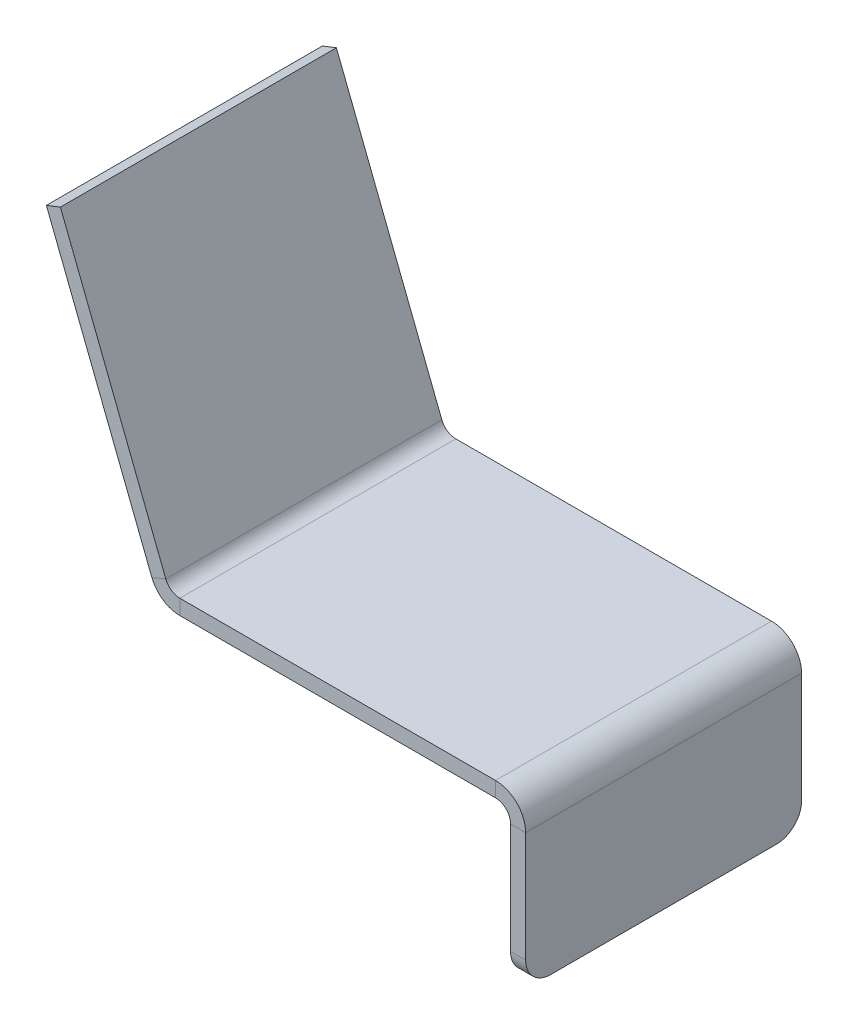
ISO-10303-21;
HEADER;
FILE_DESCRIPTION(('STEP AP214'),'2;1');
FILE_NAME('part.step','',(''),(''),'','','');
FILE_SCHEMA(('AUTOMOTIVE_DESIGN { 1 0 10303 214 1 1 1 1 }'));
ENDSEC;
DATA;
#1=APPLICATION_CONTEXT('core data for automotive mechanical design processes');
#2=APPLICATION_PROTOCOL_DEFINITION('international standard','automotive_design',2000,#1);
#3=PRODUCT_CONTEXT('',#1,'mechanical');
#4=PRODUCT('Part','Part','',(#3));
#5=PRODUCT_RELATED_PRODUCT_CATEGORY('part','',(#4));
#6=PRODUCT_DEFINITION_FORMATION('','',#4);
#7=PRODUCT_DEFINITION_CONTEXT('part definition',#1,'design');
#8=PRODUCT_DEFINITION('design','',#6,#7);
#9=PRODUCT_DEFINITION_SHAPE('','',#8);
#10=(LENGTH_UNIT() NAMED_UNIT(*) SI_UNIT(.MILLI.,.METRE.));
#11=(NAMED_UNIT(*) PLANE_ANGLE_UNIT() SI_UNIT($,.RADIAN.));
#12=(NAMED_UNIT(*) SI_UNIT($,.STERADIAN.) SOLID_ANGLE_UNIT());
#13=UNCERTAINTY_MEASURE_WITH_UNIT(LENGTH_MEASURE(1.E-05),#10,'distance_accuracy_value','');
#14=(GEOMETRIC_REPRESENTATION_CONTEXT(3) GLOBAL_UNCERTAINTY_ASSIGNED_CONTEXT((#13)) GLOBAL_UNIT_ASSIGNED_CONTEXT((#10,
#11,#12)) REPRESENTATION_CONTEXT('',''));
#15=CARTESIAN_POINT('',(0.,0.,0.));
#16=DIRECTION('',(0.,0.,1.));
#17=DIRECTION('',(1.,0.,0.));
#18=AXIS2_PLACEMENT_3D('',#15,#16,#17);
#19=CARTESIAN_POINT('',(42.0154404194215,-107.372792182966,110.));
#20=DIRECTION('',(0.,0.,1.));
#21=DIRECTION('',(1.,0.,0.));
#22=AXIS2_PLACEMENT_3D('',#19,#20,#21);
#23=PLANE('',#22);
#24=DIRECTION('',(0.931242779705752,0.364399348580515,0.));
#25=VECTOR('',#24,1.);
#26=CARTESIAN_POINT('',(42.0154404194215,-107.372792182966,110.));
#27=LINE('',#26,#25);
#28=CARTESIAN_POINT('',(42.0154404194215,-107.372792182966,110.));
#29=VERTEX_POINT('',#28);
#30=CARTESIAN_POINT('',(47.6028970976561,-105.186396091483,110.));
#31=VERTEX_POINT('',#30);
#32=EDGE_CURVE('E264',#29,#31,#27,.T.);
#33=ORIENTED_EDGE('',*,*,#32,.F.);
#34=CARTESIAN_POINT('',(53.1903537758906,-103.,110.));
#35=DIRECTION('',(0.,0.,-1.));
#36=DIRECTION('',(-1.,0.,0.));
#37=AXIS2_PLACEMENT_3D('',#34,#35,#36);
#38=CIRCLE('',#37,12.);
#39=CARTESIAN_POINT('',(53.1903537758906,-115.,110.));
#40=VERTEX_POINT('',#39);
#41=EDGE_CURVE('E191',#29,#40,#38,.F.);
#42=ORIENTED_EDGE('',*,*,#41,.T.);
#43=DIRECTION('',(0.,-1.,0.));
#44=VECTOR('',#43,1.);
#45=CARTESIAN_POINT('',(53.1903537758906,-109.,110.));
#46=LINE('',#45,#44);
#47=CARTESIAN_POINT('',(53.1903537758906,-109.,110.));
#48=VERTEX_POINT('',#47);
#49=EDGE_CURVE('E262',#48,#40,#46,.T.);
#50=ORIENTED_EDGE('',*,*,#49,.F.);
#51=CARTESIAN_POINT('',(53.1903537758906,-103.,110.));
#52=DIRECTION('',(0.,0.,1.));
#53=DIRECTION('',(1.,0.,0.));
#54=AXIS2_PLACEMENT_3D('',#51,#52,#53);
#55=CIRCLE('',#54,6.);
#56=EDGE_CURVE('E176',#31,#48,#55,.T.);
#57=ORIENTED_EDGE('',*,*,#56,.F.);
#58=EDGE_LOOP('',(#33,#42,#50,#57));
#59=FACE_BOUND('',#58,.T.);
#60=ADVANCED_FACE('F38',(#59),#23,.T.);
#61=CARTESIAN_POINT('',(53.1903537758906,-109.,110.));
#62=DIRECTION('',(0.,0.,1.));
#63=DIRECTION('',(1.,0.,0.));
#64=AXIS2_PLACEMENT_3D('',#61,#62,#63);
#65=PLANE('',#64);
#66=DIRECTION('',(0.364399348580512,-0.931242779705754,0.));
#67=VECTOR('',#66,1.);
#68=CARTESIAN_POINT('',(0.,0.,110.));
#69=LINE('',#68,#67);
#70=CARTESIAN_POINT('',(0.,0.,110.));
#71=VERTEX_POINT('',#70);
#72=EDGE_CURVE('E188',#71,#29,#69,.T.);
#73=ORIENTED_EDGE('',*,*,#72,.T.);
#74=ORIENTED_EDGE('',*,*,#32,.T.);
#75=DIRECTION('',(0.364399348580512,-0.931242779705754,0.));
#76=VECTOR('',#75,1.);
#77=CARTESIAN_POINT('',(5.58745667823452,2.18639609148308,110.));
#78=LINE('',#77,#76);
#79=CARTESIAN_POINT('',(5.58745667823452,2.18639609148308,110.));
#80=VERTEX_POINT('',#79);
#81=EDGE_CURVE('E182',#80,#31,#78,.T.);
#82=ORIENTED_EDGE('',*,*,#81,.F.);
#83=DIRECTION('',(0.931242779705753,0.364399348580512,0.));
#84=VECTOR('',#83,1.);
#85=CARTESIAN_POINT('',(0.,0.,110.));
#86=LINE('',#85,#84);
#87=EDGE_CURVE('E185',#71,#80,#86,.T.);
#88=ORIENTED_EDGE('',*,*,#87,.F.);
#89=EDGE_LOOP('',(#73,#74,#82,#88));
#90=FACE_BOUND('',#89,.T.);
#91=ADVANCED_FACE('F324',(#90),#65,.T.);
#92=CARTESIAN_POINT('',(53.1903537758906,-115.,0.));
#93=DIRECTION('',(0.,0.,-1.));
#94=DIRECTION('',(-1.,0.,0.));
#95=AXIS2_PLACEMENT_3D('',#92,#93,#94);
#96=PLANE('',#95);
#97=DIRECTION('',(0.,1.,0.));
#98=VECTOR('',#97,1.);
#99=CARTESIAN_POINT('',(53.1903537758906,-115.,0.));
#100=LINE('',#99,#98);
#101=CARTESIAN_POINT('',(53.1903537758906,-115.,0.));
#102=VERTEX_POINT('',#101);
#103=CARTESIAN_POINT('',(53.1903537758906,-109.,0.));
#104=VERTEX_POINT('',#103);
#105=EDGE_CURVE('E260',#102,#104,#100,.T.);
#106=ORIENTED_EDGE('',*,*,#105,.F.);
#107=CARTESIAN_POINT('',(53.1903537758906,-103.,0.));
#108=DIRECTION('',(0.,0.,-1.));
#109=DIRECTION('',(-1.,0.,0.));
#110=AXIS2_PLACEMENT_3D('',#107,#108,#109);
#111=CIRCLE('',#110,12.);
#112=CARTESIAN_POINT('',(42.0154404194215,-107.372792182966,0.));
#113=VERTEX_POINT('',#112);
#114=EDGE_CURVE('E220',#113,#102,#111,.F.);
#115=ORIENTED_EDGE('',*,*,#114,.F.);
#116=DIRECTION('',(-0.931242779705752,-0.364399348580515,0.));
#117=VECTOR('',#116,1.);
#118=CARTESIAN_POINT('',(47.6028970976561,-105.186396091483,0.));
#119=LINE('',#118,#117);
#120=CARTESIAN_POINT('',(47.6028970976561,-105.186396091483,0.));
#121=VERTEX_POINT('',#120);
#122=EDGE_CURVE('E258',#121,#113,#119,.T.);
#123=ORIENTED_EDGE('',*,*,#122,.F.);
#124=CARTESIAN_POINT('',(53.1903537758906,-103.,0.));
#125=DIRECTION('',(0.,0.,1.));
#126=DIRECTION('',(1.,0.,0.));
#127=AXIS2_PLACEMENT_3D('',#124,#125,#126);
#128=CIRCLE('',#127,6.);
#129=EDGE_CURVE('E208',#121,#104,#128,.T.);
#130=ORIENTED_EDGE('',*,*,#129,.T.);
#131=EDGE_LOOP('',(#106,#115,#123,#130));
#132=FACE_BOUND('',#131,.T.);
#133=ADVANCED_FACE('F308',(#132),#96,.T.);
#134=CARTESIAN_POINT('',(47.6028970976561,-105.186396091483,0.));
#135=DIRECTION('',(0.,0.,-1.));
#136=DIRECTION('',(-1.,0.,0.));
#137=AXIS2_PLACEMENT_3D('',#134,#135,#136);
#138=PLANE('',#137);
#139=DIRECTION('',(1.,0.,0.));
#140=VECTOR('',#139,1.);
#141=CARTESIAN_POINT('',(45.,-115.,0.));
#142=LINE('',#141,#140);
#143=CARTESIAN_POINT('',(179.,-115.,0.));
#144=VERTEX_POINT('',#143);
#145=EDGE_CURVE('E223',#102,#144,#142,.T.);
#146=ORIENTED_EDGE('',*,*,#145,.F.);
#147=ORIENTED_EDGE('',*,*,#105,.T.);
#148=DIRECTION('',(1.,0.,0.));
#149=VECTOR('',#148,1.);
#150=CARTESIAN_POINT('',(45.,-109.,0.));
#151=LINE('',#150,#149);
#152=CARTESIAN_POINT('',(179.,-109.,0.));
#153=VERTEX_POINT('',#152);
#154=EDGE_CURVE('E205',#104,#153,#151,.T.);
#155=ORIENTED_EDGE('',*,*,#154,.T.);
#156=DIRECTION('',(0.,-1.,0.));
#157=VECTOR('',#156,1.);
#158=CARTESIAN_POINT('',(179.,-109.,0.));
#159=LINE('',#158,#157);
#160=EDGE_CURVE('E254',#153,#144,#159,.T.);
#161=ORIENTED_EDGE('',*,*,#160,.T.);
#162=EDGE_LOOP('',(#146,#147,#155,#161));
#163=FACE_BOUND('',#162,.T.);
#164=ADVANCED_FACE('F301',(#163),#138,.T.);
#165=CARTESIAN_POINT('',(179.,-115.,110.));
#166=DIRECTION('',(0.,0.,1.));
#167=DIRECTION('',(1.,0.,0.));
#168=AXIS2_PLACEMENT_3D('',#165,#166,#167);
#169=PLANE('',#168);
#170=DIRECTION('',(0.,1.,0.));
#171=VECTOR('',#170,1.);
#172=CARTESIAN_POINT('',(179.,-115.,110.));
#173=LINE('',#172,#171);
#174=CARTESIAN_POINT('',(179.,-115.,110.));
#175=VERTEX_POINT('',#174);
#176=CARTESIAN_POINT('',(179.,-109.,110.));
#177=VERTEX_POINT('',#176);
#178=EDGE_CURVE('E150',#175,#177,#173,.T.);
#179=ORIENTED_EDGE('',*,*,#178,.F.);
#180=CARTESIAN_POINT('',(179.,-121.,110.));
#181=DIRECTION('',(0.,0.,1.));
#182=DIRECTION('',(1.,0.,0.));
#183=AXIS2_PLACEMENT_3D('',#180,#181,#182);
#184=CIRCLE('',#183,6.);
#185=CARTESIAN_POINT('',(185.,-121.,110.));
#186=VERTEX_POINT('',#185);
#187=EDGE_CURVE('E148',#175,#186,#184,.F.);
#188=ORIENTED_EDGE('',*,*,#187,.T.);
#189=DIRECTION('',(-1.,0.,0.));
#190=VECTOR('',#189,1.);
#191=CARTESIAN_POINT('',(191.,-121.,110.));
#192=LINE('',#191,#190);
#193=CARTESIAN_POINT('',(191.,-121.,110.));
#194=VERTEX_POINT('',#193);
#195=EDGE_CURVE('E141',#194,#186,#192,.T.);
#196=ORIENTED_EDGE('',*,*,#195,.F.);
#197=CARTESIAN_POINT('',(179.,-121.,110.));
#198=DIRECTION('',(0.,0.,1.));
#199=DIRECTION('',(1.,0.,0.));
#200=AXIS2_PLACEMENT_3D('',#197,#198,#199);
#201=CIRCLE('',#200,12.);
#202=EDGE_CURVE('E145',#177,#194,#201,.F.);
#203=ORIENTED_EDGE('',*,*,#202,.F.);
#204=EDGE_LOOP('',(#179,#188,#196,#203));
#205=FACE_BOUND('',#204,.T.);
#206=ADVANCED_FACE('F143',(#205),#169,.T.);
#207=CARTESIAN_POINT('',(191.,-121.,110.));
#208=DIRECTION('',(0.,0.,1.));
#209=DIRECTION('',(1.,0.,0.));
#210=AXIS2_PLACEMENT_3D('',#207,#208,#209);
#211=PLANE('',#210);
#212=DIRECTION('',(1.,0.,0.));
#213=VECTOR('',#212,1.);
#214=CARTESIAN_POINT('',(45.,-115.,110.));
#215=LINE('',#214,#213);
#216=EDGE_CURVE('E194',#40,#175,#215,.T.);
#217=ORIENTED_EDGE('',*,*,#216,.T.);
#218=ORIENTED_EDGE('',*,*,#178,.T.);
#219=DIRECTION('',(1.,0.,0.));
#220=VECTOR('',#219,1.);
#221=CARTESIAN_POINT('',(45.,-109.,110.));
#222=LINE('',#221,#220);
#223=EDGE_CURVE('E174',#48,#177,#222,.T.);
#224=ORIENTED_EDGE('',*,*,#223,.F.);
#225=ORIENTED_EDGE('',*,*,#49,.T.);
#226=EDGE_LOOP('',(#217,#218,#224,#225));
#227=FACE_BOUND('',#226,.T.);
#228=ADVANCED_FACE('F338',(#227),#211,.T.);
#229=CARTESIAN_POINT('',(185.,-121.,0.));
#230=DIRECTION('',(0.,0.,-1.));
#231=DIRECTION('',(-1.,0.,0.));
#232=AXIS2_PLACEMENT_3D('',#229,#230,#231);
#233=PLANE('',#232);
#234=DIRECTION('',(1.,0.,0.));
#235=VECTOR('',#234,1.);
#236=CARTESIAN_POINT('',(185.,-121.,0.));
#237=LINE('',#236,#235);
#238=CARTESIAN_POINT('',(185.,-121.,0.));
#239=VERTEX_POINT('',#238);
#240=CARTESIAN_POINT('',(191.,-121.,0.));
#241=VERTEX_POINT('',#240);
#242=EDGE_CURVE('E151',#239,#241,#237,.T.);
#243=ORIENTED_EDGE('',*,*,#242,.F.);
#244=CARTESIAN_POINT('',(179.,-121.,0.));
#245=DIRECTION('',(0.,0.,1.));
#246=DIRECTION('',(1.,0.,0.));
#247=AXIS2_PLACEMENT_3D('',#244,#245,#246);
#248=CIRCLE('',#247,6.);
#249=EDGE_CURVE('E226',#144,#239,#248,.F.);
#250=ORIENTED_EDGE('',*,*,#249,.F.);
#251=ORIENTED_EDGE('',*,*,#160,.F.);
#252=CARTESIAN_POINT('',(179.,-121.,0.));
#253=DIRECTION('',(0.,0.,1.));
#254=DIRECTION('',(1.,0.,0.));
#255=AXIS2_PLACEMENT_3D('',#252,#253,#254);
#256=CIRCLE('',#255,12.);
#257=EDGE_CURVE('E203',#153,#241,#256,.F.);
#258=ORIENTED_EDGE('',*,*,#257,.T.);
#259=EDGE_LOOP('',(#243,#250,#251,#258));
#260=FACE_BOUND('',#259,.T.);
#261=ADVANCED_FACE('F297',(#260),#233,.T.);
#262=CARTESIAN_POINT('',(179.,-109.,0.));
#263=DIRECTION('',(0.,0.,-1.));
#264=DIRECTION('',(-1.,0.,0.));
#265=AXIS2_PLACEMENT_3D('',#262,#263,#264);
#266=PLANE('',#265);
#267=DIRECTION('',(0.,1.,0.));
#268=VECTOR('',#267,1.);
#269=CARTESIAN_POINT('',(191.,-115.,0.));
#270=LINE('',#269,#268);
#271=CARTESIAN_POINT('',(191.,-165.,0.));
#272=VERTEX_POINT('',#271);
#273=EDGE_CURVE('E161',#241,#272,#270,.F.);
#274=ORIENTED_EDGE('',*,*,#273,.T.);
#275=DIRECTION('',(-1.,0.,0.));
#276=VECTOR('',#275,1.);
#277=CARTESIAN_POINT('',(179.,-165.,0.));
#278=LINE('',#277,#276);
#279=CARTESIAN_POINT('',(185.,-165.,0.));
#280=VERTEX_POINT('',#279);
#281=EDGE_CURVE('E266',#272,#280,#278,.T.);
#282=ORIENTED_EDGE('',*,*,#281,.T.);
#283=DIRECTION('',(0.,-1.,0.));
#284=VECTOR('',#283,1.);
#285=CARTESIAN_POINT('',(185.,-115.,0.));
#286=LINE('',#285,#284);
#287=EDGE_CURVE('E199',#239,#280,#286,.T.);
#288=ORIENTED_EDGE('',*,*,#287,.F.);
#289=ORIENTED_EDGE('',*,*,#242,.T.);
#290=EDGE_LOOP('',(#274,#282,#288,#289));
#291=FACE_BOUND('',#290,.T.);
#292=ADVANCED_FACE('F282',(#291),#266,.T.);
#293=CARTESIAN_POINT('',(185.,-115.,110.));
#294=DIRECTION('',(1.,0.,0.));
#295=DIRECTION('',(0.,0.,-1.));
#296=AXIS2_PLACEMENT_3D('',#293,#294,#295);
#297=PLANE('',#296);
#298=ORIENTED_EDGE('',*,*,#287,.T.);
#299=CARTESIAN_POINT('',(185.,-165.,10.));
#300=DIRECTION('',(1.,0.,0.));
#301=DIRECTION('',(0.,0.,-1.));
#302=AXIS2_PLACEMENT_3D('',#299,#300,#301);
#303=CIRCLE('',#302,10.);
#304=CARTESIAN_POINT('',(185.,-175.,10.));
#305=VERTEX_POINT('',#304);
#306=EDGE_CURVE('E271',#280,#305,#303,.F.);
#307=ORIENTED_EDGE('',*,*,#306,.T.);
#308=DIRECTION('',(0.,0.,-1.));
#309=VECTOR('',#308,1.);
#310=CARTESIAN_POINT('',(185.,-175.,110.));
#311=LINE('',#310,#309);
#312=CARTESIAN_POINT('',(185.,-175.,100.));
#313=VERTEX_POINT('',#312);
#314=EDGE_CURVE('E252',#313,#305,#311,.T.);
#315=ORIENTED_EDGE('',*,*,#314,.F.);
#316=CARTESIAN_POINT('',(185.,-165.,100.));
#317=DIRECTION('',(1.,0.,0.));
#318=DIRECTION('',(0.,0.,-1.));
#319=AXIS2_PLACEMENT_3D('',#316,#317,#318);
#320=CIRCLE('',#319,10.);
#321=CARTESIAN_POINT('',(185.,-165.,110.));
#322=VERTEX_POINT('',#321);
#323=EDGE_CURVE('E269',#313,#322,#320,.F.);
#324=ORIENTED_EDGE('',*,*,#323,.T.);
#325=DIRECTION('',(0.,-1.,0.));
#326=VECTOR('',#325,1.);
#327=CARTESIAN_POINT('',(185.,-115.,110.));
#328=LINE('',#327,#326);
#329=EDGE_CURVE('E169',#186,#322,#328,.T.);
#330=ORIENTED_EDGE('',*,*,#329,.F.);
#331=DIRECTION('',(0.,0.,-1.));
#332=VECTOR('',#331,1.);
#333=CARTESIAN_POINT('',(185.,-121.,110.));
#334=LINE('',#333,#332);
#335=EDGE_CURVE('E198',#186,#239,#334,.T.);
#336=ORIENTED_EDGE('',*,*,#335,.T.);
#337=EDGE_LOOP('',(#298,#307,#315,#324,#330,#336));
#338=FACE_BOUND('',#337,.T.);
#339=ADVANCED_FACE('F287',(#338),#297,.F.);
#340=CARTESIAN_POINT('',(191.,-175.,110.));
#341=DIRECTION('',(0.,-1.,0.));
#342=DIRECTION('',(0.,0.,-1.));
#343=AXIS2_PLACEMENT_3D('',#340,#341,#342);
#344=PLANE('',#343);
#345=ORIENTED_EDGE('',*,*,#314,.T.);
#346=DIRECTION('',(-1.,0.,0.));
#347=VECTOR('',#346,1.);
#348=CARTESIAN_POINT('',(191.,-175.,10.));
#349=LINE('',#348,#347);
#350=CARTESIAN_POINT('',(191.,-175.,10.));
#351=VERTEX_POINT('',#350);
#352=EDGE_CURVE('E59',#305,#351,#349,.F.);
#353=ORIENTED_EDGE('',*,*,#352,.T.);
#354=DIRECTION('',(0.,0.,-1.));
#355=VECTOR('',#354,1.);
#356=CARTESIAN_POINT('',(191.,-175.,110.));
#357=LINE('',#356,#355);
#358=CARTESIAN_POINT('',(191.,-175.,100.));
#359=VERTEX_POINT('',#358);
#360=EDGE_CURVE('E165',#359,#351,#357,.T.);
#361=ORIENTED_EDGE('',*,*,#360,.F.);
#362=DIRECTION('',(-1.,0.,0.));
#363=VECTOR('',#362,1.);
#364=CARTESIAN_POINT('',(191.,-175.,100.));
#365=LINE('',#364,#363);
#366=EDGE_CURVE('E273',#359,#313,#365,.T.);
#367=ORIENTED_EDGE('',*,*,#366,.T.);
#368=EDGE_LOOP('',(#345,#353,#361,#367));
#369=FACE_BOUND('',#368,.T.);
#370=ADVANCED_FACE('F288',(#369),#344,.T.);
#371=CARTESIAN_POINT('',(191.,-115.,110.));
#372=DIRECTION('',(1.,0.,0.));
#373=DIRECTION('',(0.,0.,-1.));
#374=AXIS2_PLACEMENT_3D('',#371,#372,#373);
#375=PLANE('',#374);
#376=ORIENTED_EDGE('',*,*,#360,.T.);
#377=CARTESIAN_POINT('',(191.,-165.,10.));
#378=DIRECTION('',(1.,0.,0.));
#379=DIRECTION('',(0.,0.,-1.));
#380=AXIS2_PLACEMENT_3D('',#377,#378,#379);
#381=CIRCLE('',#380,10.);
#382=EDGE_CURVE('E46',#351,#272,#381,.T.);
#383=ORIENTED_EDGE('',*,*,#382,.T.);
#384=ORIENTED_EDGE('',*,*,#273,.F.);
#385=DIRECTION('',(0.,0.,-1.));
#386=VECTOR('',#385,1.);
#387=CARTESIAN_POINT('',(191.,-121.,110.));
#388=LINE('',#387,#386);
#389=EDGE_CURVE('E156',#194,#241,#388,.T.);
#390=ORIENTED_EDGE('',*,*,#389,.F.);
#391=DIRECTION('',(0.,1.,0.));
#392=VECTOR('',#391,1.);
#393=CARTESIAN_POINT('',(191.,-115.,110.));
#394=LINE('',#393,#392);
#395=CARTESIAN_POINT('',(191.,-165.,110.));
#396=VERTEX_POINT('',#395);
#397=EDGE_CURVE('E158',#194,#396,#394,.F.);
#398=ORIENTED_EDGE('',*,*,#397,.T.);
#399=CARTESIAN_POINT('',(191.,-165.,100.));
#400=DIRECTION('',(1.,0.,0.));
#401=DIRECTION('',(0.,0.,-1.));
#402=AXIS2_PLACEMENT_3D('',#399,#400,#401);
#403=CIRCLE('',#402,10.);
#404=EDGE_CURVE('E277',#396,#359,#403,.T.);
#405=ORIENTED_EDGE('',*,*,#404,.T.);
#406=EDGE_LOOP('',(#376,#383,#384,#390,#398,#405));
#407=FACE_BOUND('',#406,.T.);
#408=ADVANCED_FACE('F157',(#407),#375,.T.);
#409=CARTESIAN_POINT('',(179.,-121.,110.));
#410=DIRECTION('',(0.,0.,-1.));
#411=DIRECTION('',(-1.,0.,0.));
#412=AXIS2_PLACEMENT_3D('',#409,#410,#411);
#413=CYLINDRICAL_SURFACE('',#412,12.);
#414=ORIENTED_EDGE('',*,*,#257,.F.);
#415=DIRECTION('',(0.,0.,-1.));
#416=VECTOR('',#415,1.);
#417=CARTESIAN_POINT('',(179.,-109.,110.));
#418=LINE('',#417,#416);
#419=EDGE_CURVE('E166',#177,#153,#418,.T.);
#420=ORIENTED_EDGE('',*,*,#419,.F.);
#421=ORIENTED_EDGE('',*,*,#202,.T.);
#422=ORIENTED_EDGE('',*,*,#389,.T.);
#423=EDGE_LOOP('',(#414,#420,#421,#422));
#424=FACE_BOUND('',#423,.T.);
#425=ADVANCED_FACE('F172',(#424),#413,.T.);
#426=CARTESIAN_POINT('',(45.,-109.,110.));
#427=DIRECTION('',(0.,1.,0.));
#428=DIRECTION('',(0.,0.,1.));
#429=AXIS2_PLACEMENT_3D('',#426,#427,#428);
#430=PLANE('',#429);
#431=ORIENTED_EDGE('',*,*,#154,.F.);
#432=DIRECTION('',(0.,0.,-1.));
#433=VECTOR('',#432,1.);
#434=CARTESIAN_POINT('',(53.1903537758906,-109.,110.));
#435=LINE('',#434,#433);
#436=EDGE_CURVE('E247',#48,#104,#435,.T.);
#437=ORIENTED_EDGE('',*,*,#436,.F.);
#438=ORIENTED_EDGE('',*,*,#223,.T.);
#439=ORIENTED_EDGE('',*,*,#419,.T.);
#440=EDGE_LOOP('',(#431,#437,#438,#439));
#441=FACE_BOUND('',#440,.T.);
#442=ADVANCED_FACE('F304',(#441),#430,.T.);
#443=CARTESIAN_POINT('',(53.1903537758906,-103.,110.));
#444=DIRECTION('',(0.,0.,-1.));
#445=DIRECTION('',(-1.,0.,0.));
#446=AXIS2_PLACEMENT_3D('',#443,#444,#445);
#447=CYLINDRICAL_SURFACE('',#446,6.);
#448=ORIENTED_EDGE('',*,*,#129,.F.);
#449=DIRECTION('',(0.,0.,-1.));
#450=VECTOR('',#449,1.);
#451=CARTESIAN_POINT('',(47.6028970976561,-105.186396091483,110.));
#452=LINE('',#451,#450);
#453=EDGE_CURVE('E244',#31,#121,#452,.T.);
#454=ORIENTED_EDGE('',*,*,#453,.F.);
#455=ORIENTED_EDGE('',*,*,#56,.T.);
#456=ORIENTED_EDGE('',*,*,#436,.T.);
#457=EDGE_LOOP('',(#448,#454,#455,#456));
#458=FACE_BOUND('',#457,.T.);
#459=ADVANCED_FACE('F312',(#458),#447,.F.);
#460=CARTESIAN_POINT('',(5.58745667823452,2.18639609148308,110.));
#461=DIRECTION('',(0.931242779705753,0.364399348580512,0.));
#462=DIRECTION('',(-0.364399348580512,0.931242779705754,0.));
#463=AXIS2_PLACEMENT_3D('',#460,#461,#462);
#464=PLANE('',#463);
#465=DIRECTION('',(0.364399348580512,-0.931242779705754,0.));
#466=VECTOR('',#465,1.);
#467=CARTESIAN_POINT('',(5.58745667823452,2.18639609148308,0.));
#468=LINE('',#467,#466);
#469=CARTESIAN_POINT('',(5.58745667823452,2.18639609148308,0.));
#470=VERTEX_POINT('',#469);
#471=EDGE_CURVE('E211',#470,#121,#468,.T.);
#472=ORIENTED_EDGE('',*,*,#471,.F.);
#473=DIRECTION('',(0.,0.,-1.));
#474=VECTOR('',#473,1.);
#475=CARTESIAN_POINT('',(5.58745667823452,2.18639609148308,110.));
#476=LINE('',#475,#474);
#477=EDGE_CURVE('E242',#80,#470,#476,.T.);
#478=ORIENTED_EDGE('',*,*,#477,.F.);
#479=ORIENTED_EDGE('',*,*,#81,.T.);
#480=ORIENTED_EDGE('',*,*,#453,.T.);
#481=EDGE_LOOP('',(#472,#478,#479,#480));
#482=FACE_BOUND('',#481,.T.);
#483=ADVANCED_FACE('F320',(#482),#464,.T.);
#484=CARTESIAN_POINT('',(0.,0.,110.));
#485=DIRECTION('',(-0.364399348580512,0.931242779705754,0.));
#486=DIRECTION('',(-0.931242779705754,-0.364399348580512,0.));
#487=AXIS2_PLACEMENT_3D('',#484,#485,#486);
#488=PLANE('',#487);
#489=DIRECTION('',(0.931242779705753,0.364399348580512,0.));
#490=VECTOR('',#489,1.);
#491=CARTESIAN_POINT('',(0.,0.,0.));
#492=LINE('',#491,#490);
#493=CARTESIAN_POINT('',(0.,0.,0.));
#494=VERTEX_POINT('',#493);
#495=EDGE_CURVE('E214',#494,#470,#492,.T.);
#496=ORIENTED_EDGE('',*,*,#495,.F.);
#497=DIRECTION('',(0.,0.,-1.));
#498=VECTOR('',#497,1.);
#499=CARTESIAN_POINT('',(0.,0.,110.));
#500=LINE('',#499,#498);
#501=EDGE_CURVE('E240',#71,#494,#500,.T.);
#502=ORIENTED_EDGE('',*,*,#501,.F.);
#503=ORIENTED_EDGE('',*,*,#87,.T.);
#504=ORIENTED_EDGE('',*,*,#477,.T.);
#505=EDGE_LOOP('',(#496,#502,#503,#504));
#506=FACE_BOUND('',#505,.T.);
#507=ADVANCED_FACE('F326',(#506),#488,.T.);
#508=CARTESIAN_POINT('',(0.,0.,110.));
#509=DIRECTION('',(0.931242779705754,0.364399348580512,0.));
#510=DIRECTION('',(-0.364399348580512,0.931242779705754,0.));
#511=AXIS2_PLACEMENT_3D('',#508,#509,#510);
#512=PLANE('',#511);
#513=DIRECTION('',(0.364399348580512,-0.931242779705754,0.));
#514=VECTOR('',#513,1.);
#515=CARTESIAN_POINT('',(0.,0.,0.));
#516=LINE('',#515,#514);
#517=EDGE_CURVE('E217',#494,#113,#516,.T.);
#518=ORIENTED_EDGE('',*,*,#517,.T.);
#519=DIRECTION('',(0.,0.,-1.));
#520=VECTOR('',#519,1.);
#521=CARTESIAN_POINT('',(42.0154404194215,-107.372792182966,110.));
#522=LINE('',#521,#520);
#523=EDGE_CURVE('E237',#29,#113,#522,.T.);
#524=ORIENTED_EDGE('',*,*,#523,.F.);
#525=ORIENTED_EDGE('',*,*,#72,.F.);
#526=ORIENTED_EDGE('',*,*,#501,.T.);
#527=EDGE_LOOP('',(#518,#524,#525,#526));
#528=FACE_BOUND('',#527,.T.);
#529=ADVANCED_FACE('F330',(#528),#512,.F.);
#530=CARTESIAN_POINT('',(53.1903537758906,-103.,110.));
#531=DIRECTION('',(0.,0.,-1.));
#532=DIRECTION('',(-1.,0.,0.));
#533=AXIS2_PLACEMENT_3D('',#530,#531,#532);
#534=CYLINDRICAL_SURFACE('',#533,12.);
#535=ORIENTED_EDGE('',*,*,#114,.T.);
#536=DIRECTION('',(0.,0.,-1.));
#537=VECTOR('',#536,1.);
#538=CARTESIAN_POINT('',(53.1903537758906,-115.,110.));
#539=LINE('',#538,#537);
#540=EDGE_CURVE('E234',#40,#102,#539,.T.);
#541=ORIENTED_EDGE('',*,*,#540,.F.);
#542=ORIENTED_EDGE('',*,*,#41,.F.);
#543=ORIENTED_EDGE('',*,*,#523,.T.);
#544=EDGE_LOOP('',(#535,#541,#542,#543));
#545=FACE_BOUND('',#544,.T.);
#546=ADVANCED_FACE('F334',(#545),#534,.T.);
#547=CARTESIAN_POINT('',(45.,-115.,110.));
#548=DIRECTION('',(0.,1.,0.));
#549=DIRECTION('',(0.,0.,1.));
#550=AXIS2_PLACEMENT_3D('',#547,#548,#549);
#551=PLANE('',#550);
#552=ORIENTED_EDGE('',*,*,#145,.T.);
#553=DIRECTION('',(0.,0.,-1.));
#554=VECTOR('',#553,1.);
#555=CARTESIAN_POINT('',(179.,-115.,110.));
#556=LINE('',#555,#554);
#557=EDGE_CURVE('E231',#175,#144,#556,.T.);
#558=ORIENTED_EDGE('',*,*,#557,.F.);
#559=ORIENTED_EDGE('',*,*,#216,.F.);
#560=ORIENTED_EDGE('',*,*,#540,.T.);
#561=EDGE_LOOP('',(#552,#558,#559,#560));
#562=FACE_BOUND('',#561,.T.);
#563=ADVANCED_FACE('F340',(#562),#551,.F.);
#564=CARTESIAN_POINT('',(179.,-121.,110.));
#565=DIRECTION('',(0.,0.,-1.));
#566=DIRECTION('',(-1.,0.,0.));
#567=AXIS2_PLACEMENT_3D('',#564,#565,#566);
#568=CYLINDRICAL_SURFACE('',#567,6.);
#569=ORIENTED_EDGE('',*,*,#249,.T.);
#570=ORIENTED_EDGE('',*,*,#335,.F.);
#571=ORIENTED_EDGE('',*,*,#187,.F.);
#572=ORIENTED_EDGE('',*,*,#557,.T.);
#573=EDGE_LOOP('',(#569,#570,#571,#572));
#574=FACE_BOUND('',#573,.T.);
#575=ADVANCED_FACE('F293',(#574),#568,.F.);
#576=CARTESIAN_POINT('',(179.,-121.,110.));
#577=DIRECTION('',(0.,0.,1.));
#578=DIRECTION('',(1.,0.,0.));
#579=AXIS2_PLACEMENT_3D('',#576,#577,#578);
#580=PLANE('',#579);
#581=ORIENTED_EDGE('',*,*,#329,.T.);
#582=DIRECTION('',(-1.,0.,0.));
#583=VECTOR('',#582,1.);
#584=CARTESIAN_POINT('',(179.,-165.,110.));
#585=LINE('',#584,#583);
#586=EDGE_CURVE('E11',#322,#396,#585,.F.);
#587=ORIENTED_EDGE('',*,*,#586,.T.);
#588=ORIENTED_EDGE('',*,*,#397,.F.);
#589=ORIENTED_EDGE('',*,*,#195,.T.);
#590=EDGE_LOOP('',(#581,#587,#588,#589));
#591=FACE_BOUND('',#590,.T.);
#592=ADVANCED_FACE('F168',(#591),#580,.T.);
#593=CARTESIAN_POINT('',(179.,-121.,0.));
#594=DIRECTION('',(0.,0.,1.));
#595=DIRECTION('',(1.,0.,0.));
#596=AXIS2_PLACEMENT_3D('',#593,#594,#595);
#597=PLANE('',#596);
#598=ORIENTED_EDGE('',*,*,#471,.T.);
#599=ORIENTED_EDGE('',*,*,#122,.T.);
#600=ORIENTED_EDGE('',*,*,#517,.F.);
#601=ORIENTED_EDGE('',*,*,#495,.T.);
#602=EDGE_LOOP('',(#598,#599,#600,#601));
#603=FACE_BOUND('',#602,.T.);
#604=ADVANCED_FACE('F316',(#603),#597,.F.);
#605=CARTESIAN_POINT('',(179.,-165.,10.));
#606=DIRECTION('',(-1.,0.,0.));
#607=DIRECTION('',(0.,0.,1.));
#608=AXIS2_PLACEMENT_3D('',#605,#606,#607);
#609=CYLINDRICAL_SURFACE('',#608,10.);
#610=ORIENTED_EDGE('',*,*,#382,.F.);
#611=ORIENTED_EDGE('',*,*,#352,.F.);
#612=ORIENTED_EDGE('',*,*,#306,.F.);
#613=ORIENTED_EDGE('',*,*,#281,.F.);
#614=EDGE_LOOP('',(#610,#611,#612,#613));
#615=FACE_BOUND('',#614,.T.);
#616=ADVANCED_FACE('F284',(#615),#609,.T.);
#617=CARTESIAN_POINT('',(191.,-165.,100.));
#618=DIRECTION('',(-1.,0.,0.));
#619=DIRECTION('',(0.,0.,1.));
#620=AXIS2_PLACEMENT_3D('',#617,#618,#619);
#621=CYLINDRICAL_SURFACE('',#620,10.);
#622=ORIENTED_EDGE('',*,*,#404,.F.);
#623=ORIENTED_EDGE('',*,*,#586,.F.);
#624=ORIENTED_EDGE('',*,*,#323,.F.);
#625=ORIENTED_EDGE('',*,*,#366,.F.);
#626=EDGE_LOOP('',(#622,#623,#624,#625));
#627=FACE_BOUND('',#626,.T.);
#628=ADVANCED_FACE('F40',(#627),#621,.T.);
#629=CLOSED_SHELL('',(#60,#91,#133,#164,#206,#228,#261,#292,#339,#370,#408,#425,#442,#459,#483,
#507,#529,#546,#563,#575,#592,#604,#616,#628));
#630=MANIFOLD_SOLID_BREP('B2',#629);
#631=ADVANCED_BREP_SHAPE_REPRESENTATION('',(#18,#630),#14);
#632=SHAPE_DEFINITION_REPRESENTATION(#9,#631);
ENDSEC;
END-ISO-10303-21;
